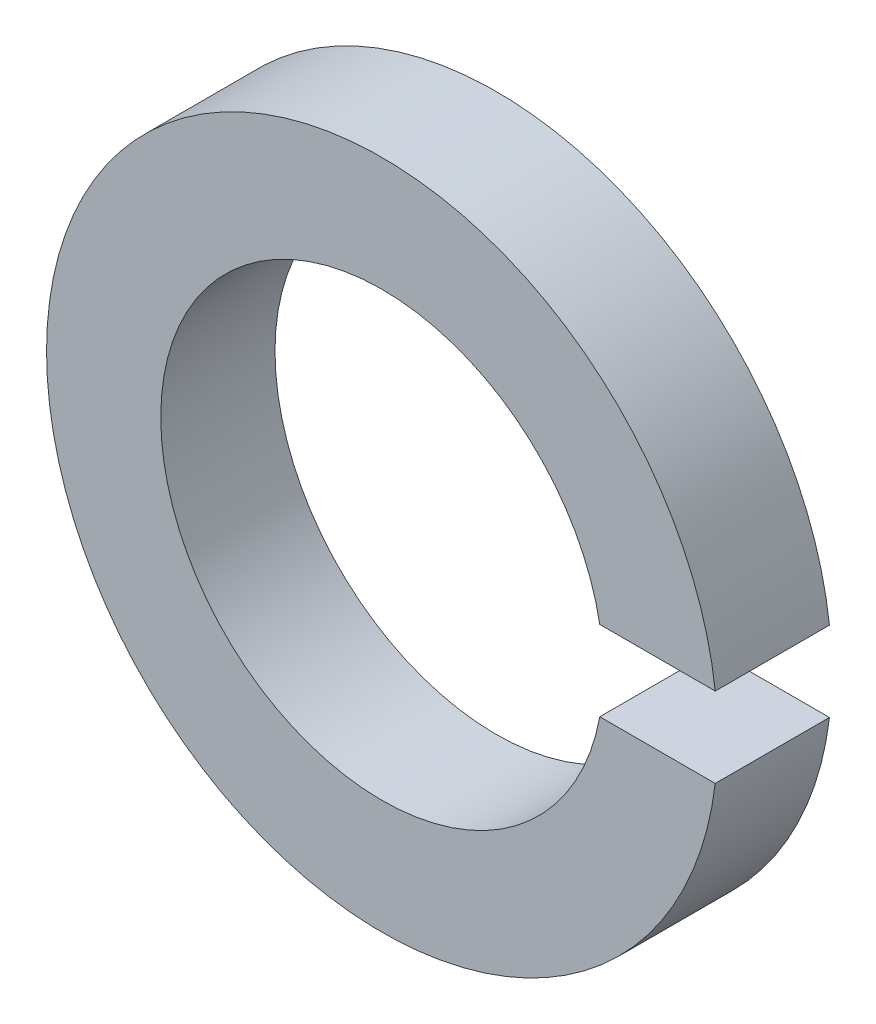
ISO-10303-21;
HEADER;
FILE_DESCRIPTION(('STEP AP214'),'2;1');
FILE_NAME('part.step','',(''),(''),'','','');
FILE_SCHEMA(('AUTOMOTIVE_DESIGN { 1 0 10303 214 1 1 1 1 }'));
ENDSEC;
DATA;
#1=APPLICATION_CONTEXT('core data for automotive mechanical design processes');
#2=APPLICATION_PROTOCOL_DEFINITION('international standard','automotive_design',2000,#1);
#3=PRODUCT_CONTEXT('',#1,'mechanical');
#4=PRODUCT('Part','Part','',(#3));
#5=PRODUCT_RELATED_PRODUCT_CATEGORY('part','',(#4));
#6=PRODUCT_DEFINITION_FORMATION('','',#4);
#7=PRODUCT_DEFINITION_CONTEXT('part definition',#1,'design');
#8=PRODUCT_DEFINITION('design','',#6,#7);
#9=PRODUCT_DEFINITION_SHAPE('','',#8);
#10=(LENGTH_UNIT() NAMED_UNIT(*) SI_UNIT(.MILLI.,.METRE.));
#11=(NAMED_UNIT(*) PLANE_ANGLE_UNIT() SI_UNIT($,.RADIAN.));
#12=(NAMED_UNIT(*) SI_UNIT($,.STERADIAN.) SOLID_ANGLE_UNIT());
#13=UNCERTAINTY_MEASURE_WITH_UNIT(LENGTH_MEASURE(1.E-05),#10,'distance_accuracy_value','');
#14=(GEOMETRIC_REPRESENTATION_CONTEXT(3) GLOBAL_UNCERTAINTY_ASSIGNED_CONTEXT((#13)) GLOBAL_UNIT_ASSIGNED_CONTEXT((#10,
#11,#12)) REPRESENTATION_CONTEXT('',''));
#15=CARTESIAN_POINT('',(0.,0.,0.));
#16=DIRECTION('',(0.,0.,1.));
#17=DIRECTION('',(1.,0.,0.));
#18=AXIS2_PLACEMENT_3D('',#15,#16,#17);
#19=CARTESIAN_POINT('',(0.,0.,0.8));
#20=DIRECTION('',(0.,0.,1.));
#21=DIRECTION('',(1.,0.,0.));
#22=AXIS2_PLACEMENT_3D('',#19,#20,#21);
#23=PLANE('',#22);
#24=DIRECTION('',(-1.,0.,0.));
#25=VECTOR('',#24,1.);
#26=CARTESIAN_POINT('',(1.50629206700984,0.28,0.8));
#27=LINE('',#26,#25);
#28=CARTESIAN_POINT('',(2.33325952264209,0.28,0.8));
#29=VERTEX_POINT('',#28);
#30=CARTESIAN_POINT('',(1.5244999180059,0.28,0.8));
#31=VERTEX_POINT('',#30);
#32=EDGE_CURVE('E50',#29,#31,#27,.T.);
#33=ORIENTED_EDGE('',*,*,#32,.F.);
#34=CARTESIAN_POINT('',(0.,0.,0.8));
#35=DIRECTION('',(0.,0.,1.));
#36=DIRECTION('',(1.,0.,0.));
#37=AXIS2_PLACEMENT_3D('',#34,#35,#36);
#38=CIRCLE('',#37,2.35);
#39=CARTESIAN_POINT('',(2.33325952264209,-0.28,0.8));
#40=VERTEX_POINT('',#39);
#41=EDGE_CURVE('E73',#29,#40,#38,.T.);
#42=ORIENTED_EDGE('',*,*,#41,.T.);
#43=DIRECTION('',(1.,0.,0.));
#44=VECTOR('',#43,1.);
#45=CARTESIAN_POINT('',(1.50629206700984,-0.28,0.8));
#46=LINE('',#45,#44);
#47=CARTESIAN_POINT('',(1.5244999180059,-0.28,0.8));
#48=VERTEX_POINT('',#47);
#49=EDGE_CURVE('E67',#48,#40,#46,.T.);
#50=ORIENTED_EDGE('',*,*,#49,.F.);
#51=CARTESIAN_POINT('',(0.,0.,0.8));
#52=DIRECTION('',(0.,0.,1.));
#53=DIRECTION('',(1.,0.,0.));
#54=AXIS2_PLACEMENT_3D('',#51,#52,#53);
#55=CIRCLE('',#54,1.55);
#56=EDGE_CURVE('E77',#31,#48,#55,.T.);
#57=ORIENTED_EDGE('',*,*,#56,.F.);
#58=EDGE_LOOP('',(#33,#42,#50,#57));
#59=FACE_BOUND('',#58,.T.);
#60=ADVANCED_FACE('F28',(#59),#23,.T.);
#61=CARTESIAN_POINT('',(0.,0.,0.));
#62=DIRECTION('',(0.,0.,1.));
#63=DIRECTION('',(1.,0.,0.));
#64=AXIS2_PLACEMENT_3D('',#61,#62,#63);
#65=PLANE('',#64);
#66=CARTESIAN_POINT('',(0.,0.,0.));
#67=DIRECTION('',(0.,0.,1.));
#68=DIRECTION('',(1.,0.,0.));
#69=AXIS2_PLACEMENT_3D('',#66,#67,#68);
#70=CIRCLE('',#69,2.35);
#71=CARTESIAN_POINT('',(2.33325952264209,0.28,0.));
#72=VERTEX_POINT('',#71);
#73=CARTESIAN_POINT('',(2.33325952264209,-0.28,0.));
#74=VERTEX_POINT('',#73);
#75=EDGE_CURVE('E81',#72,#74,#70,.T.);
#76=ORIENTED_EDGE('',*,*,#75,.F.);
#77=DIRECTION('',(-1.,0.,0.));
#78=VECTOR('',#77,1.);
#79=CARTESIAN_POINT('',(1.50629206700984,0.28,0.));
#80=LINE('',#79,#78);
#81=CARTESIAN_POINT('',(1.5244999180059,0.28,0.));
#82=VERTEX_POINT('',#81);
#83=EDGE_CURVE('E94',#72,#82,#80,.T.);
#84=ORIENTED_EDGE('',*,*,#83,.T.);
#85=CARTESIAN_POINT('',(0.,0.,0.));
#86=DIRECTION('',(0.,0.,1.));
#87=DIRECTION('',(1.,0.,0.));
#88=AXIS2_PLACEMENT_3D('',#85,#86,#87);
#89=CIRCLE('',#88,1.55);
#90=CARTESIAN_POINT('',(1.5244999180059,-0.28,0.));
#91=VERTEX_POINT('',#90);
#92=EDGE_CURVE('E82',#82,#91,#89,.T.);
#93=ORIENTED_EDGE('',*,*,#92,.T.);
#94=DIRECTION('',(1.,0.,0.));
#95=VECTOR('',#94,1.);
#96=CARTESIAN_POINT('',(1.50629206700984,-0.28,0.));
#97=LINE('',#96,#95);
#98=EDGE_CURVE('E43',#91,#74,#97,.T.);
#99=ORIENTED_EDGE('',*,*,#98,.T.);
#100=EDGE_LOOP('',(#76,#84,#93,#99));
#101=FACE_BOUND('',#100,.T.);
#102=ADVANCED_FACE('F100',(#101),#65,.F.);
#103=CARTESIAN_POINT('',(0.,0.,0.8));
#104=DIRECTION('',(0.,0.,-1.));
#105=DIRECTION('',(-1.,0.,0.));
#106=AXIS2_PLACEMENT_3D('',#103,#104,#105);
#107=CYLINDRICAL_SURFACE('',#106,2.35);
#108=ORIENTED_EDGE('',*,*,#41,.F.);
#109=DIRECTION('',(0.,0.,-1.));
#110=VECTOR('',#109,1.);
#111=CARTESIAN_POINT('',(2.33325952264209,0.28,0.8));
#112=LINE('',#111,#110);
#113=EDGE_CURVE('E86',#29,#72,#112,.T.);
#114=ORIENTED_EDGE('',*,*,#113,.T.);
#115=ORIENTED_EDGE('',*,*,#75,.T.);
#116=DIRECTION('',(0.,0.,-1.));
#117=VECTOR('',#116,1.);
#118=CARTESIAN_POINT('',(2.33325952264209,-0.28,0.8));
#119=LINE('',#118,#117);
#120=EDGE_CURVE('E92',#74,#40,#119,.F.);
#121=ORIENTED_EDGE('',*,*,#120,.T.);
#122=EDGE_LOOP('',(#108,#114,#115,#121));
#123=FACE_BOUND('',#122,.T.);
#124=ADVANCED_FACE('F30',(#123),#107,.T.);
#125=CARTESIAN_POINT('',(0.,0.,0.8));
#126=DIRECTION('',(0.,0.,-1.));
#127=DIRECTION('',(-1.,0.,0.));
#128=AXIS2_PLACEMENT_3D('',#125,#126,#127);
#129=CYLINDRICAL_SURFACE('',#128,1.55);
#130=DIRECTION('',(0.,0.,-1.));
#131=VECTOR('',#130,1.);
#132=CARTESIAN_POINT('',(1.5244999180059,0.28,0.8));
#133=LINE('',#132,#131);
#134=EDGE_CURVE('E11',#31,#82,#133,.T.);
#135=ORIENTED_EDGE('',*,*,#134,.F.);
#136=ORIENTED_EDGE('',*,*,#56,.T.);
#137=DIRECTION('',(0.,0.,-1.));
#138=VECTOR('',#137,1.);
#139=CARTESIAN_POINT('',(1.5244999180059,-0.28,0.8));
#140=LINE('',#139,#138);
#141=EDGE_CURVE('E36',#91,#48,#140,.F.);
#142=ORIENTED_EDGE('',*,*,#141,.F.);
#143=ORIENTED_EDGE('',*,*,#92,.F.);
#144=EDGE_LOOP('',(#135,#136,#142,#143));
#145=FACE_BOUND('',#144,.T.);
#146=ADVANCED_FACE('F80',(#145),#129,.F.);
#147=CARTESIAN_POINT('',(1.50629206700984,-0.28,0.));
#148=DIRECTION('',(0.,-1.,0.));
#149=DIRECTION('',(0.,0.,-1.));
#150=AXIS2_PLACEMENT_3D('',#147,#148,#149);
#151=PLANE('',#150);
#152=ORIENTED_EDGE('',*,*,#98,.F.);
#153=ORIENTED_EDGE('',*,*,#141,.T.);
#154=ORIENTED_EDGE('',*,*,#49,.T.);
#155=ORIENTED_EDGE('',*,*,#120,.F.);
#156=EDGE_LOOP('',(#152,#153,#154,#155));
#157=FACE_BOUND('',#156,.T.);
#158=ADVANCED_FACE('F66',(#157),#151,.F.);
#159=CARTESIAN_POINT('',(1.50629206700984,0.28,0.));
#160=DIRECTION('',(0.,1.,0.));
#161=DIRECTION('',(0.,0.,1.));
#162=AXIS2_PLACEMENT_3D('',#159,#160,#161);
#163=PLANE('',#162);
#164=ORIENTED_EDGE('',*,*,#32,.T.);
#165=ORIENTED_EDGE('',*,*,#134,.T.);
#166=ORIENTED_EDGE('',*,*,#83,.F.);
#167=ORIENTED_EDGE('',*,*,#113,.F.);
#168=EDGE_LOOP('',(#164,#165,#166,#167));
#169=FACE_BOUND('',#168,.T.);
#170=ADVANCED_FACE('F102',(#169),#163,.F.);
#171=CLOSED_SHELL('',(#60,#102,#124,#146,#158,#170));
#172=MANIFOLD_SOLID_BREP('B2',#171);
#173=ADVANCED_BREP_SHAPE_REPRESENTATION('',(#18,#172),#14);
#174=SHAPE_DEFINITION_REPRESENTATION(#9,#173);
ENDSEC;
END-ISO-10303-21;
